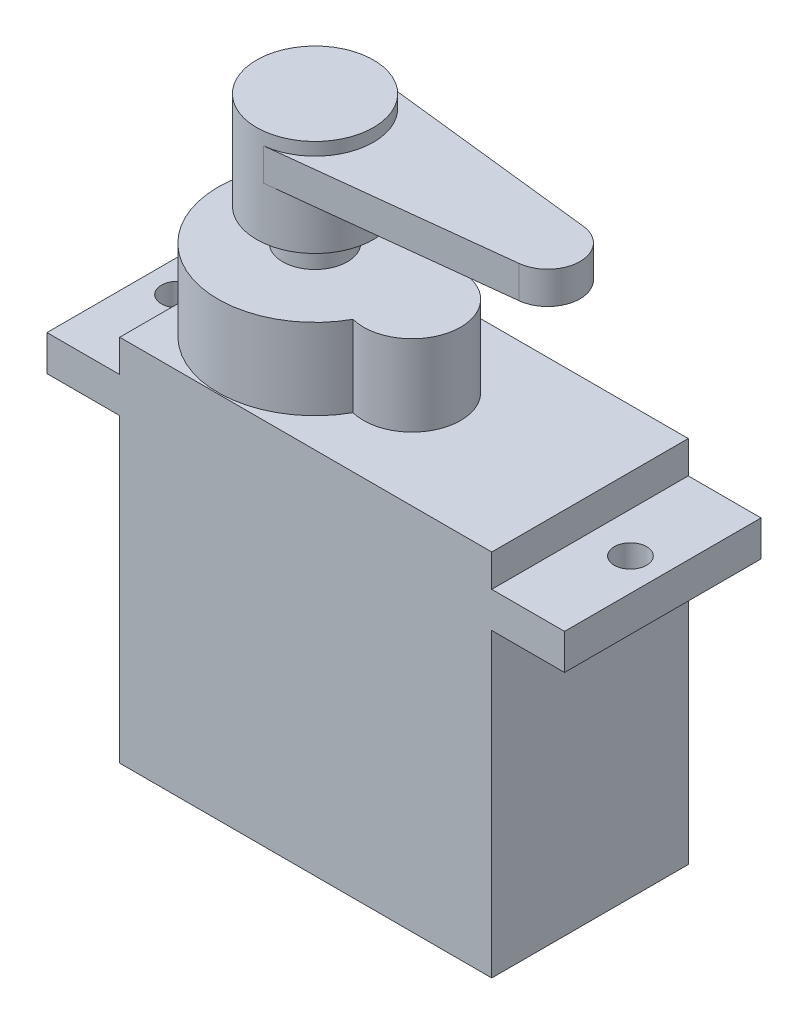
ISO-10303-21;
HEADER;
FILE_DESCRIPTION(('STEP AP214'),'2;1');
FILE_NAME('part.step','',(''),(''),'','','');
FILE_SCHEMA(('AUTOMOTIVE_DESIGN { 1 0 10303 214 1 1 1 1 }'));
ENDSEC;
DATA;
#1=APPLICATION_CONTEXT('core data for automotive mechanical design processes');
#2=APPLICATION_PROTOCOL_DEFINITION('international standard','automotive_design',2000,#1);
#3=PRODUCT_CONTEXT('',#1,'mechanical');
#4=PRODUCT('Part','Part','',(#3));
#5=PRODUCT_RELATED_PRODUCT_CATEGORY('part','',(#4));
#6=PRODUCT_DEFINITION_FORMATION('','',#4);
#7=PRODUCT_DEFINITION_CONTEXT('part definition',#1,'design');
#8=PRODUCT_DEFINITION('design','',#6,#7);
#9=PRODUCT_DEFINITION_SHAPE('','',#8);
#10=(LENGTH_UNIT() NAMED_UNIT(*) SI_UNIT(.MILLI.,.METRE.));
#11=(NAMED_UNIT(*) PLANE_ANGLE_UNIT() SI_UNIT($,.RADIAN.));
#12=(NAMED_UNIT(*) SI_UNIT($,.STERADIAN.) SOLID_ANGLE_UNIT());
#13=UNCERTAINTY_MEASURE_WITH_UNIT(LENGTH_MEASURE(1.E-05),#10,'distance_accuracy_value','');
#14=(GEOMETRIC_REPRESENTATION_CONTEXT(3) GLOBAL_UNCERTAINTY_ASSIGNED_CONTEXT((#13)) GLOBAL_UNIT_ASSIGNED_CONTEXT((#10,
#11,#12)) REPRESENTATION_CONTEXT('',''));
#15=CARTESIAN_POINT('',(0.,0.,0.));
#16=DIRECTION('',(0.,0.,1.));
#17=DIRECTION('',(1.,0.,0.));
#18=AXIS2_PLACEMENT_3D('',#15,#16,#17);
#19=CARTESIAN_POINT('',(-8.12640264026402,16.5354785478548,6.075));
#20=DIRECTION('',(0.,-1.,0.));
#21=DIRECTION('',(0.,0.,-1.));
#22=AXIS2_PLACEMENT_3D('',#19,#20,#21);
#23=CYLINDRICAL_SURFACE('',#22,3.615);
#24=CARTESIAN_POINT('',(-8.12640264026402,10.5354785478548,6.075));
#25=DIRECTION('',(0.,1.,0.));
#26=DIRECTION('',(0.,0.,1.));
#27=AXIS2_PLACEMENT_3D('',#24,#25,#26);
#28=CIRCLE('',#27,3.615);
#29=CARTESIAN_POINT('',(-8.12640264026402,10.5354785478548,9.69));
#30=VERTEX_POINT('',#29);
#31=EDGE_CURVE('E220',#30,#30,#28,.T.);
#32=ORIENTED_EDGE('',*,*,#31,.T.);
#33=EDGE_LOOP('',(#32));
#34=FACE_BOUND('',#33,.T.);
#35=CARTESIAN_POINT('',(-8.12640264026402,16.5354785478548,6.075));
#36=DIRECTION('',(0.,1.,0.));
#37=DIRECTION('',(0.,0.,1.));
#38=AXIS2_PLACEMENT_3D('',#35,#36,#37);
#39=CIRCLE('',#38,3.615);
#40=CARTESIAN_POINT('',(-8.12640264026402,16.5354785478548,9.69));
#41=VERTEX_POINT('',#40);
#42=EDGE_CURVE('E224',#41,#41,#39,.T.);
#43=ORIENTED_EDGE('',*,*,#42,.F.);
#44=EDGE_LOOP('',(#43));
#45=FACE_BOUND('',#44,.T.);
#46=CARTESIAN_POINT('',(-8.12640264026402,13.7454785478548,6.075));
#47=DIRECTION('',(0.,1.,0.));
#48=DIRECTION('',(0.,0.,1.));
#49=AXIS2_PLACEMENT_3D('',#46,#47,#48);
#50=CIRCLE('',#49,3.615);
#51=CARTESIAN_POINT('',(-7.72054758291261,13.7454785478548,9.66714513521131));
#52=VERTEX_POINT('',#51);
#53=CARTESIAN_POINT('',(-7.72054758291261,13.7454785478548,2.48285486478869));
#54=VERTEX_POINT('',#53);
#55=EDGE_CURVE('E193',#52,#54,#50,.T.);
#56=ORIENTED_EDGE('',*,*,#55,.F.);
#57=DIRECTION('',(0.,1.,0.));
#58=VECTOR('',#57,1.);
#59=CARTESIAN_POINT('',(-7.72054758291261,13.7454785478548,9.66714513521131));
#60=LINE('',#59,#58);
#61=CARTESIAN_POINT('',(-7.72054758291261,15.7454785478548,9.66714513521131));
#62=VERTEX_POINT('',#61);
#63=EDGE_CURVE('E199',#52,#62,#60,.T.);
#64=ORIENTED_EDGE('',*,*,#63,.T.);
#65=CARTESIAN_POINT('',(-8.12640264026402,15.7454785478548,6.075));
#66=DIRECTION('',(0.,1.,0.));
#67=DIRECTION('',(0.,0.,1.));
#68=AXIS2_PLACEMENT_3D('',#65,#66,#67);
#69=CIRCLE('',#68,3.615);
#70=CARTESIAN_POINT('',(-7.72054758291261,15.7454785478548,2.48285486478869));
#71=VERTEX_POINT('',#70);
#72=EDGE_CURVE('E203',#62,#71,#69,.T.);
#73=ORIENTED_EDGE('',*,*,#72,.T.);
#74=DIRECTION('',(0.,1.,0.));
#75=VECTOR('',#74,1.);
#76=CARTESIAN_POINT('',(-7.72054758291261,13.7454785478548,2.48285486478869));
#77=LINE('',#76,#75);
#78=EDGE_CURVE('E221',#54,#71,#77,.T.);
#79=ORIENTED_EDGE('',*,*,#78,.F.);
#80=EDGE_LOOP('',(#56,#64,#73,#79));
#81=FACE_BOUND('',#80,.T.);
#82=ADVANCED_FACE('F51',(#34,#45,#81),#23,.T.);
#83=CARTESIAN_POINT('',(8.87359735973598,-0.664521452145198,12.15));
#84=DIRECTION('',(-1.,0.,0.));
#85=DIRECTION('',(0.,-1.,0.));
#86=AXIS2_PLACEMENT_3D('',#83,#84,#85);
#87=PLANE('',#86);
#88=DIRECTION('',(0.,1.,0.));
#89=VECTOR('',#88,1.);
#90=CARTESIAN_POINT('',(8.87359735973598,-0.664521452145198,0.));
#91=LINE('',#90,#89);
#92=CARTESIAN_POINT('',(8.87359735973598,-19.2745214521452,0.));
#93=VERTEX_POINT('',#92);
#94=CARTESIAN_POINT('',(8.87359735973598,-0.664521452145198,0.));
#95=VERTEX_POINT('',#94);
#96=EDGE_CURVE('E259',#93,#95,#91,.T.);
#97=ORIENTED_EDGE('',*,*,#96,.T.);
#98=DIRECTION('',(0.,0.,-1.));
#99=VECTOR('',#98,1.);
#100=CARTESIAN_POINT('',(8.87359735973598,-0.664521452145198,12.15));
#101=LINE('',#100,#99);
#102=CARTESIAN_POINT('',(8.87359735973598,-0.664521452145198,12.15));
#103=VERTEX_POINT('',#102);
#104=EDGE_CURVE('E344',#103,#95,#101,.T.);
#105=ORIENTED_EDGE('',*,*,#104,.F.);
#106=DIRECTION('',(0.,1.,0.));
#107=VECTOR('',#106,1.);
#108=CARTESIAN_POINT('',(8.87359735973598,-0.664521452145198,12.15));
#109=LINE('',#108,#107);
#110=CARTESIAN_POINT('',(8.87359735973598,-19.2745214521452,12.15));
#111=VERTEX_POINT('',#110);
#112=EDGE_CURVE('E260',#111,#103,#109,.T.);
#113=ORIENTED_EDGE('',*,*,#112,.F.);
#114=DIRECTION('',(0.,0.,-1.));
#115=VECTOR('',#114,1.);
#116=CARTESIAN_POINT('',(8.87359735973598,-19.2745214521452,12.15));
#117=LINE('',#116,#115);
#118=EDGE_CURVE('E286',#111,#93,#117,.T.);
#119=ORIENTED_EDGE('',*,*,#118,.T.);
#120=EDGE_LOOP('',(#97,#105,#113,#119));
#121=FACE_BOUND('',#120,.T.);
#122=ADVANCED_FACE('F53',(#121),#87,.F.);
#123=CARTESIAN_POINT('',(13.373597359736,-0.664521452145197,12.15));
#124=DIRECTION('',(0.,1.,0.));
#125=DIRECTION('',(-1.,0.,0.));
#126=AXIS2_PLACEMENT_3D('',#123,#124,#125);
#127=PLANE('',#126);
#128=CARTESIAN_POINT('',(11.373597359736,-0.664521452145198,6.075));
#129=DIRECTION('',(0.,1.,0.));
#130=DIRECTION('',(-1.,0.,0.));
#131=AXIS2_PLACEMENT_3D('',#128,#129,#130);
#132=CIRCLE('',#131,1.);
#133=CARTESIAN_POINT('',(10.373597359736,-0.664521452145198,6.075));
#134=VERTEX_POINT('',#133);
#135=EDGE_CURVE('E256',#134,#134,#132,.T.);
#136=ORIENTED_EDGE('',*,*,#135,.T.);
#137=EDGE_LOOP('',(#136));
#138=FACE_BOUND('',#137,.T.);
#139=DIRECTION('',(1.,0.,0.));
#140=VECTOR('',#139,1.);
#141=CARTESIAN_POINT('',(13.373597359736,-0.664521452145197,0.));
#142=LINE('',#141,#140);
#143=CARTESIAN_POINT('',(13.373597359736,-0.664521452145197,0.));
#144=VERTEX_POINT('',#143);
#145=EDGE_CURVE('E289',#95,#144,#142,.T.);
#146=ORIENTED_EDGE('',*,*,#145,.T.);
#147=DIRECTION('',(0.,0.,-1.));
#148=VECTOR('',#147,1.);
#149=CARTESIAN_POINT('',(13.373597359736,-0.664521452145197,12.15));
#150=LINE('',#149,#148);
#151=CARTESIAN_POINT('',(13.373597359736,-0.664521452145197,12.15));
#152=VERTEX_POINT('',#151);
#153=EDGE_CURVE('E342',#152,#144,#150,.T.);
#154=ORIENTED_EDGE('',*,*,#153,.F.);
#155=DIRECTION('',(1.,0.,0.));
#156=VECTOR('',#155,1.);
#157=CARTESIAN_POINT('',(13.373597359736,-0.664521452145197,12.15));
#158=LINE('',#157,#156);
#159=EDGE_CURVE('E263',#103,#152,#158,.T.);
#160=ORIENTED_EDGE('',*,*,#159,.F.);
#161=ORIENTED_EDGE('',*,*,#104,.T.);
#162=EDGE_LOOP('',(#146,#154,#160,#161));
#163=FACE_BOUND('',#162,.T.);
#164=ADVANCED_FACE('F379',(#138,#163),#127,.F.);
#165=CARTESIAN_POINT('',(13.373597359736,1.5354785478548,12.15));
#166=DIRECTION('',(-1.,0.,0.));
#167=DIRECTION('',(0.,0.,1.));
#168=AXIS2_PLACEMENT_3D('',#165,#166,#167);
#169=PLANE('',#168);
#170=DIRECTION('',(0.,1.,0.));
#171=VECTOR('',#170,1.);
#172=CARTESIAN_POINT('',(13.373597359736,1.5354785478548,0.));
#173=LINE('',#172,#171);
#174=CARTESIAN_POINT('',(13.373597359736,1.5354785478548,0.));
#175=VERTEX_POINT('',#174);
#176=EDGE_CURVE('E291',#144,#175,#173,.T.);
#177=ORIENTED_EDGE('',*,*,#176,.T.);
#178=DIRECTION('',(0.,0.,-1.));
#179=VECTOR('',#178,1.);
#180=CARTESIAN_POINT('',(13.373597359736,1.5354785478548,12.15));
#181=LINE('',#180,#179);
#182=CARTESIAN_POINT('',(13.373597359736,1.5354785478548,12.15));
#183=VERTEX_POINT('',#182);
#184=EDGE_CURVE('E339',#183,#175,#181,.T.);
#185=ORIENTED_EDGE('',*,*,#184,.F.);
#186=DIRECTION('',(0.,1.,0.));
#187=VECTOR('',#186,1.);
#188=CARTESIAN_POINT('',(13.373597359736,1.5354785478548,12.15));
#189=LINE('',#188,#187);
#190=EDGE_CURVE('E266',#152,#183,#189,.T.);
#191=ORIENTED_EDGE('',*,*,#190,.F.);
#192=ORIENTED_EDGE('',*,*,#153,.T.);
#193=EDGE_LOOP('',(#177,#185,#191,#192));
#194=FACE_BOUND('',#193,.T.);
#195=ADVANCED_FACE('F603',(#194),#169,.F.);
#196=CARTESIAN_POINT('',(8.87359735973597,1.5354785478548,12.15));
#197=DIRECTION('',(0.,-1.,0.));
#198=DIRECTION('',(0.,0.,-1.));
#199=AXIS2_PLACEMENT_3D('',#196,#197,#198);
#200=PLANE('',#199);
#201=CARTESIAN_POINT('',(11.373597359736,1.53547854785478,6.075));
#202=DIRECTION('',(0.,1.,0.));
#203=DIRECTION('',(0.,0.,1.));
#204=AXIS2_PLACEMENT_3D('',#201,#202,#203);
#205=CIRCLE('',#204,1.);
#206=CARTESIAN_POINT('',(11.373597359736,1.53547854785478,7.075));
#207=VERTEX_POINT('',#206);
#208=EDGE_CURVE('E250',#207,#207,#205,.T.);
#209=ORIENTED_EDGE('',*,*,#208,.F.);
#210=EDGE_LOOP('',(#209));
#211=FACE_BOUND('',#210,.T.);
#212=DIRECTION('',(-1.,0.,0.));
#213=VECTOR('',#212,1.);
#214=CARTESIAN_POINT('',(8.87359735973597,1.5354785478548,0.));
#215=LINE('',#214,#213);
#216=CARTESIAN_POINT('',(8.87359735973597,1.5354785478548,0.));
#217=VERTEX_POINT('',#216);
#218=EDGE_CURVE('E293',#175,#217,#215,.T.);
#219=ORIENTED_EDGE('',*,*,#218,.T.);
#220=DIRECTION('',(0.,0.,-1.));
#221=VECTOR('',#220,1.);
#222=CARTESIAN_POINT('',(8.87359735973597,1.5354785478548,12.15));
#223=LINE('',#222,#221);
#224=CARTESIAN_POINT('',(8.87359735973597,1.5354785478548,12.15));
#225=VERTEX_POINT('',#224);
#226=EDGE_CURVE('E336',#225,#217,#223,.T.);
#227=ORIENTED_EDGE('',*,*,#226,.F.);
#228=DIRECTION('',(-1.,0.,0.));
#229=VECTOR('',#228,1.);
#230=CARTESIAN_POINT('',(8.87359735973597,1.5354785478548,12.15));
#231=LINE('',#230,#229);
#232=EDGE_CURVE('E268',#183,#225,#231,.T.);
#233=ORIENTED_EDGE('',*,*,#232,.F.);
#234=ORIENTED_EDGE('',*,*,#184,.T.);
#235=EDGE_LOOP('',(#219,#227,#233,#234));
#236=FACE_BOUND('',#235,.T.);
#237=ADVANCED_FACE('F594',(#211,#236),#200,.F.);
#238=CARTESIAN_POINT('',(8.87359735973598,3.5354785478548,12.15));
#239=DIRECTION('',(-1.,0.,0.));
#240=DIRECTION('',(0.,-1.,0.));
#241=AXIS2_PLACEMENT_3D('',#238,#239,#240);
#242=PLANE('',#241);
#243=DIRECTION('',(0.,1.,0.));
#244=VECTOR('',#243,1.);
#245=CARTESIAN_POINT('',(8.87359735973598,3.5354785478548,0.));
#246=LINE('',#245,#244);
#247=CARTESIAN_POINT('',(8.87359735973598,3.5354785478548,0.));
#248=VERTEX_POINT('',#247);
#249=EDGE_CURVE('E295',#217,#248,#246,.T.);
#250=ORIENTED_EDGE('',*,*,#249,.T.);
#251=DIRECTION('',(0.,0.,-1.));
#252=VECTOR('',#251,1.);
#253=CARTESIAN_POINT('',(8.87359735973598,3.5354785478548,12.15));
#254=LINE('',#253,#252);
#255=CARTESIAN_POINT('',(8.87359735973598,3.5354785478548,12.15));
#256=VERTEX_POINT('',#255);
#257=EDGE_CURVE('E333',#256,#248,#254,.T.);
#258=ORIENTED_EDGE('',*,*,#257,.F.);
#259=DIRECTION('',(0.,1.,0.));
#260=VECTOR('',#259,1.);
#261=CARTESIAN_POINT('',(8.87359735973598,3.5354785478548,12.15));
#262=LINE('',#261,#260);
#263=EDGE_CURVE('E270',#225,#256,#262,.T.);
#264=ORIENTED_EDGE('',*,*,#263,.F.);
#265=ORIENTED_EDGE('',*,*,#226,.T.);
#266=EDGE_LOOP('',(#250,#258,#264,#265));
#267=FACE_BOUND('',#266,.T.);
#268=ADVANCED_FACE('F585',(#267),#242,.F.);
#269=CARTESIAN_POINT('',(-14.126402640264,3.5354785478548,12.15));
#270=DIRECTION('',(0.,-1.,0.));
#271=DIRECTION('',(0.,0.,-1.));
#272=AXIS2_PLACEMENT_3D('',#269,#270,#271);
#273=PLANE('',#272);
#274=CARTESIAN_POINT('',(-8.12640264026402,3.5354785478548,6.075));
#275=DIRECTION('',(0.,1.,0.));
#276=DIRECTION('',(0.,0.,1.));
#277=AXIS2_PLACEMENT_3D('',#274,#275,#276);
#278=CIRCLE('',#277,6.);
#279=CARTESIAN_POINT('',(-2.87640264026402,3.5354785478548,3.17026249034444));
#280=VERTEX_POINT('',#279);
#281=CARTESIAN_POINT('',(-14.126402640264,3.5354785478548,6.075));
#282=VERTEX_POINT('',#281);
#283=EDGE_CURVE('E236',#280,#282,#278,.T.);
#284=ORIENTED_EDGE('',*,*,#283,.F.);
#285=CARTESIAN_POINT('',(-2.12640264026402,3.5354785478548,6.075));
#286=DIRECTION('',(0.,1.,0.));
#287=DIRECTION('',(0.,0.,1.));
#288=AXIS2_PLACEMENT_3D('',#285,#286,#287);
#289=CIRCLE('',#288,3.);
#290=CARTESIAN_POINT('',(-2.87640264026402,3.5354785478548,8.97973750965556));
#291=VERTEX_POINT('',#290);
#292=EDGE_CURVE('E76',#291,#280,#289,.T.);
#293=ORIENTED_EDGE('',*,*,#292,.F.);
#294=EDGE_CURVE('E60',#282,#291,#278,.T.);
#295=ORIENTED_EDGE('',*,*,#294,.F.);
#296=DIRECTION('',(0.,0.,-1.));
#297=VECTOR('',#296,1.);
#298=CARTESIAN_POINT('',(-14.126402640264,3.5354785478548,12.15));
#299=LINE('',#298,#297);
#300=CARTESIAN_POINT('',(-14.126402640264,3.5354785478548,12.15));
#301=VERTEX_POINT('',#300);
#302=EDGE_CURVE('E330',#301,#282,#299,.T.);
#303=ORIENTED_EDGE('',*,*,#302,.F.);
#304=DIRECTION('',(-1.,0.,0.));
#305=VECTOR('',#304,1.);
#306=CARTESIAN_POINT('',(-14.126402640264,3.5354785478548,12.15));
#307=LINE('',#306,#305);
#308=EDGE_CURVE('E272',#256,#301,#307,.T.);
#309=ORIENTED_EDGE('',*,*,#308,.F.);
#310=ORIENTED_EDGE('',*,*,#257,.T.);
#311=DIRECTION('',(-1.,0.,0.));
#312=VECTOR('',#311,1.);
#313=CARTESIAN_POINT('',(-14.126402640264,3.5354785478548,0.));
#314=LINE('',#313,#312);
#315=CARTESIAN_POINT('',(-14.126402640264,3.5354785478548,0.));
#316=VERTEX_POINT('',#315);
#317=EDGE_CURVE('E297',#248,#316,#314,.T.);
#318=ORIENTED_EDGE('',*,*,#317,.T.);
#319=EDGE_CURVE('E329',#282,#316,#299,.T.);
#320=ORIENTED_EDGE('',*,*,#319,.F.);
#321=EDGE_LOOP('',(#284,#293,#295,#303,#309,#310,#318,#320));
#322=FACE_BOUND('',#321,.T.);
#323=ADVANCED_FACE('F576',(#322),#273,.F.);
#324=CARTESIAN_POINT('',(-14.126402640264,1.53547854785478,12.15));
#325=DIRECTION('',(1.,0.,0.));
#326=DIRECTION('',(0.,1.,0.));
#327=AXIS2_PLACEMENT_3D('',#324,#325,#326);
#328=PLANE('',#327);
#329=DIRECTION('',(0.,-1.,0.));
#330=VECTOR('',#329,1.);
#331=CARTESIAN_POINT('',(-14.126402640264,1.53547854785478,0.));
#332=LINE('',#331,#330);
#333=CARTESIAN_POINT('',(-14.126402640264,1.53547854785478,0.));
#334=VERTEX_POINT('',#333);
#335=EDGE_CURVE('E301',#316,#334,#332,.T.);
#336=ORIENTED_EDGE('',*,*,#335,.T.);
#337=DIRECTION('',(0.,0.,-1.));
#338=VECTOR('',#337,1.);
#339=CARTESIAN_POINT('',(-14.126402640264,1.53547854785478,12.15));
#340=LINE('',#339,#338);
#341=CARTESIAN_POINT('',(-14.126402640264,1.53547854785478,12.15));
#342=VERTEX_POINT('',#341);
#343=EDGE_CURVE('E326',#342,#334,#340,.T.);
#344=ORIENTED_EDGE('',*,*,#343,.F.);
#345=DIRECTION('',(0.,-1.,0.));
#346=VECTOR('',#345,1.);
#347=CARTESIAN_POINT('',(-14.126402640264,1.53547854785478,12.15));
#348=LINE('',#347,#346);
#349=EDGE_CURVE('E274',#301,#342,#348,.T.);
#350=ORIENTED_EDGE('',*,*,#349,.F.);
#351=ORIENTED_EDGE('',*,*,#302,.T.);
#352=ORIENTED_EDGE('',*,*,#319,.T.);
#353=EDGE_LOOP('',(#336,#344,#350,#351,#352));
#354=FACE_BOUND('',#353,.T.);
#355=ADVANCED_FACE('F567',(#354),#328,.F.);
#356=CARTESIAN_POINT('',(-18.626402640264,1.53547854785478,12.15));
#357=DIRECTION('',(0.,-1.,0.));
#358=DIRECTION('',(0.,0.,-1.));
#359=AXIS2_PLACEMENT_3D('',#356,#357,#358);
#360=PLANE('',#359);
#361=CARTESIAN_POINT('',(-16.626402640264,1.53547854785478,6.075));
#362=DIRECTION('',(0.,1.,0.));
#363=DIRECTION('',(0.,0.,1.));
#364=AXIS2_PLACEMENT_3D('',#361,#362,#363);
#365=CIRCLE('',#364,1.);
#366=CARTESIAN_POINT('',(-16.626402640264,1.53547854785478,7.075));
#367=VERTEX_POINT('',#366);
#368=EDGE_CURVE('E251',#367,#367,#365,.T.);
#369=ORIENTED_EDGE('',*,*,#368,.F.);
#370=EDGE_LOOP('',(#369));
#371=FACE_BOUND('',#370,.T.);
#372=DIRECTION('',(-1.,0.,0.));
#373=VECTOR('',#372,1.);
#374=CARTESIAN_POINT('',(-18.626402640264,1.53547854785478,0.));
#375=LINE('',#374,#373);
#376=CARTESIAN_POINT('',(-18.626402640264,1.53547854785478,0.));
#377=VERTEX_POINT('',#376);
#378=EDGE_CURVE('E303',#334,#377,#375,.T.);
#379=ORIENTED_EDGE('',*,*,#378,.T.);
#380=DIRECTION('',(0.,0.,-1.));
#381=VECTOR('',#380,1.);
#382=CARTESIAN_POINT('',(-18.626402640264,1.53547854785478,12.15));
#383=LINE('',#382,#381);
#384=CARTESIAN_POINT('',(-18.626402640264,1.53547854785478,12.15));
#385=VERTEX_POINT('',#384);
#386=EDGE_CURVE('E323',#385,#377,#383,.T.);
#387=ORIENTED_EDGE('',*,*,#386,.F.);
#388=DIRECTION('',(-1.,0.,0.));
#389=VECTOR('',#388,1.);
#390=CARTESIAN_POINT('',(-18.626402640264,1.53547854785478,12.15));
#391=LINE('',#390,#389);
#392=EDGE_CURVE('E276',#342,#385,#391,.T.);
#393=ORIENTED_EDGE('',*,*,#392,.F.);
#394=ORIENTED_EDGE('',*,*,#343,.T.);
#395=EDGE_LOOP('',(#379,#387,#393,#394));
#396=FACE_BOUND('',#395,.T.);
#397=ADVANCED_FACE('F558',(#371,#396),#360,.F.);
#398=CARTESIAN_POINT('',(-18.626402640264,-0.664521452145221,12.15));
#399=DIRECTION('',(1.,0.,0.));
#400=DIRECTION('',(0.,0.,-1.));
#401=AXIS2_PLACEMENT_3D('',#398,#399,#400);
#402=PLANE('',#401);
#403=DIRECTION('',(0.,-1.,0.));
#404=VECTOR('',#403,1.);
#405=CARTESIAN_POINT('',(-18.626402640264,-0.664521452145221,0.));
#406=LINE('',#405,#404);
#407=CARTESIAN_POINT('',(-18.626402640264,-0.664521452145221,0.));
#408=VERTEX_POINT('',#407);
#409=EDGE_CURVE('E305',#377,#408,#406,.T.);
#410=ORIENTED_EDGE('',*,*,#409,.T.);
#411=DIRECTION('',(0.,0.,-1.));
#412=VECTOR('',#411,1.);
#413=CARTESIAN_POINT('',(-18.626402640264,-0.664521452145221,12.15));
#414=LINE('',#413,#412);
#415=CARTESIAN_POINT('',(-18.626402640264,-0.664521452145221,12.15));
#416=VERTEX_POINT('',#415);
#417=EDGE_CURVE('E320',#416,#408,#414,.T.);
#418=ORIENTED_EDGE('',*,*,#417,.F.);
#419=DIRECTION('',(0.,-1.,0.));
#420=VECTOR('',#419,1.);
#421=CARTESIAN_POINT('',(-18.626402640264,-0.664521452145221,12.15));
#422=LINE('',#421,#420);
#423=EDGE_CURVE('E278',#385,#416,#422,.T.);
#424=ORIENTED_EDGE('',*,*,#423,.F.);
#425=ORIENTED_EDGE('',*,*,#386,.T.);
#426=EDGE_LOOP('',(#410,#418,#424,#425));
#427=FACE_BOUND('',#426,.T.);
#428=ADVANCED_FACE('F549',(#427),#402,.F.);
#429=CARTESIAN_POINT('',(-14.126402640264,-0.664521452145201,12.15));
#430=DIRECTION('',(0.,1.,0.));
#431=DIRECTION('',(-1.,0.,0.));
#432=AXIS2_PLACEMENT_3D('',#429,#430,#431);
#433=PLANE('',#432);
#434=CARTESIAN_POINT('',(-16.626402640264,-0.664521452145211,6.075));
#435=DIRECTION('',(0.,1.,0.));
#436=DIRECTION('',(-1.,0.,0.));
#437=AXIS2_PLACEMENT_3D('',#434,#435,#436);
#438=CIRCLE('',#437,1.);
#439=CARTESIAN_POINT('',(-17.626402640264,-0.664521452145216,6.075));
#440=VERTEX_POINT('',#439);
#441=EDGE_CURVE('E55',#440,#440,#438,.T.);
#442=ORIENTED_EDGE('',*,*,#441,.T.);
#443=EDGE_LOOP('',(#442));
#444=FACE_BOUND('',#443,.T.);
#445=DIRECTION('',(1.,0.,0.));
#446=VECTOR('',#445,1.);
#447=CARTESIAN_POINT('',(-14.126402640264,-0.664521452145201,0.));
#448=LINE('',#447,#446);
#449=CARTESIAN_POINT('',(-14.126402640264,-0.664521452145201,0.));
#450=VERTEX_POINT('',#449);
#451=EDGE_CURVE('E307',#408,#450,#448,.T.);
#452=ORIENTED_EDGE('',*,*,#451,.T.);
#453=DIRECTION('',(0.,0.,-1.));
#454=VECTOR('',#453,1.);
#455=CARTESIAN_POINT('',(-14.126402640264,-0.664521452145201,12.15));
#456=LINE('',#455,#454);
#457=CARTESIAN_POINT('',(-14.126402640264,-0.664521452145201,12.15));
#458=VERTEX_POINT('',#457);
#459=EDGE_CURVE('E317',#458,#450,#456,.T.);
#460=ORIENTED_EDGE('',*,*,#459,.F.);
#461=DIRECTION('',(1.,0.,0.));
#462=VECTOR('',#461,1.);
#463=CARTESIAN_POINT('',(-14.126402640264,-0.664521452145201,12.15));
#464=LINE('',#463,#462);
#465=EDGE_CURVE('E280',#416,#458,#464,.T.);
#466=ORIENTED_EDGE('',*,*,#465,.F.);
#467=ORIENTED_EDGE('',*,*,#417,.T.);
#468=EDGE_LOOP('',(#452,#460,#466,#467));
#469=FACE_BOUND('',#468,.T.);
#470=ADVANCED_FACE('F540',(#444,#469),#433,.F.);
#471=CARTESIAN_POINT('',(-14.126402640264,-19.2745214521452,12.15));
#472=DIRECTION('',(1.,0.,0.));
#473=DIRECTION('',(0.,0.,-1.));
#474=AXIS2_PLACEMENT_3D('',#471,#472,#473);
#475=PLANE('',#474);
#476=DIRECTION('',(0.,-1.,0.));
#477=VECTOR('',#476,1.);
#478=CARTESIAN_POINT('',(-14.126402640264,-19.2745214521452,0.));
#479=LINE('',#478,#477);
#480=CARTESIAN_POINT('',(-14.126402640264,-19.2745214521452,0.));
#481=VERTEX_POINT('',#480);
#482=EDGE_CURVE('E309',#450,#481,#479,.T.);
#483=ORIENTED_EDGE('',*,*,#482,.T.);
#484=DIRECTION('',(0.,0.,-1.));
#485=VECTOR('',#484,1.);
#486=CARTESIAN_POINT('',(-14.126402640264,-19.2745214521452,12.15));
#487=LINE('',#486,#485);
#488=CARTESIAN_POINT('',(-14.126402640264,-19.2745214521452,12.15));
#489=VERTEX_POINT('',#488);
#490=EDGE_CURVE('E314',#489,#481,#487,.T.);
#491=ORIENTED_EDGE('',*,*,#490,.F.);
#492=DIRECTION('',(0.,-1.,0.));
#493=VECTOR('',#492,1.);
#494=CARTESIAN_POINT('',(-14.126402640264,-19.2745214521452,12.15));
#495=LINE('',#494,#493);
#496=EDGE_CURVE('E282',#458,#489,#495,.T.);
#497=ORIENTED_EDGE('',*,*,#496,.F.);
#498=ORIENTED_EDGE('',*,*,#459,.T.);
#499=EDGE_LOOP('',(#483,#491,#497,#498));
#500=FACE_BOUND('',#499,.T.);
#501=ADVANCED_FACE('F531',(#500),#475,.F.);
#502=CARTESIAN_POINT('',(8.87359735973598,-19.2745214521452,12.15));
#503=DIRECTION('',(0.,1.,0.));
#504=DIRECTION('',(0.,0.,1.));
#505=AXIS2_PLACEMENT_3D('',#502,#503,#504);
#506=PLANE('',#505);
#507=DIRECTION('',(1.,0.,0.));
#508=VECTOR('',#507,1.);
#509=CARTESIAN_POINT('',(8.87359735973598,-19.2745214521452,0.));
#510=LINE('',#509,#508);
#511=EDGE_CURVE('E264',#481,#93,#510,.T.);
#512=ORIENTED_EDGE('',*,*,#511,.T.);
#513=ORIENTED_EDGE('',*,*,#118,.F.);
#514=DIRECTION('',(1.,0.,0.));
#515=VECTOR('',#514,1.);
#516=CARTESIAN_POINT('',(8.87359735973598,-19.2745214521452,12.15));
#517=LINE('',#516,#515);
#518=EDGE_CURVE('E284',#489,#111,#517,.T.);
#519=ORIENTED_EDGE('',*,*,#518,.F.);
#520=ORIENTED_EDGE('',*,*,#490,.T.);
#521=EDGE_LOOP('',(#512,#513,#519,#520));
#522=FACE_BOUND('',#521,.T.);
#523=ADVANCED_FACE('F522',(#522),#506,.F.);
#524=CARTESIAN_POINT('',(0.,0.,12.15));
#525=DIRECTION('',(0.,0.,-1.));
#526=DIRECTION('',(-1.,0.,0.));
#527=AXIS2_PLACEMENT_3D('',#524,#525,#526);
#528=PLANE('',#527);
#529=ORIENTED_EDGE('',*,*,#112,.T.);
#530=ORIENTED_EDGE('',*,*,#159,.T.);
#531=ORIENTED_EDGE('',*,*,#190,.T.);
#532=ORIENTED_EDGE('',*,*,#232,.T.);
#533=ORIENTED_EDGE('',*,*,#263,.T.);
#534=ORIENTED_EDGE('',*,*,#308,.T.);
#535=ORIENTED_EDGE('',*,*,#349,.T.);
#536=ORIENTED_EDGE('',*,*,#392,.T.);
#537=ORIENTED_EDGE('',*,*,#423,.T.);
#538=ORIENTED_EDGE('',*,*,#465,.T.);
#539=ORIENTED_EDGE('',*,*,#496,.T.);
#540=ORIENTED_EDGE('',*,*,#518,.T.);
#541=EDGE_LOOP('',(#529,#530,#531,#532,#533,#534,#535,#536,#537,#538,#539,#540));
#542=FACE_BOUND('',#541,.T.);
#543=ADVANCED_FACE('F512',(#542),#528,.F.);
#544=CARTESIAN_POINT('',(0.,0.,0.));
#545=DIRECTION('',(0.,0.,-1.));
#546=DIRECTION('',(-1.,0.,0.));
#547=AXIS2_PLACEMENT_3D('',#544,#545,#546);
#548=PLANE('',#547);
#549=ORIENTED_EDGE('',*,*,#96,.F.);
#550=ORIENTED_EDGE('',*,*,#511,.F.);
#551=ORIENTED_EDGE('',*,*,#482,.F.);
#552=ORIENTED_EDGE('',*,*,#451,.F.);
#553=ORIENTED_EDGE('',*,*,#409,.F.);
#554=ORIENTED_EDGE('',*,*,#378,.F.);
#555=ORIENTED_EDGE('',*,*,#335,.F.);
#556=ORIENTED_EDGE('',*,*,#317,.F.);
#557=ORIENTED_EDGE('',*,*,#249,.F.);
#558=ORIENTED_EDGE('',*,*,#218,.F.);
#559=ORIENTED_EDGE('',*,*,#176,.F.);
#560=ORIENTED_EDGE('',*,*,#145,.F.);
#561=EDGE_LOOP('',(#549,#550,#551,#552,#553,#554,#555,#556,#557,#558,#559,#560));
#562=FACE_BOUND('',#561,.T.);
#563=ADVANCED_FACE('F503',(#562),#548,.T.);
#564=CARTESIAN_POINT('',(-16.626402640264,-10.6145214521452,6.075));
#565=DIRECTION('',(0.,1.,0.));
#566=DIRECTION('',(0.,0.,1.));
#567=AXIS2_PLACEMENT_3D('',#564,#565,#566);
#568=CYLINDRICAL_SURFACE('',#567,1.);
#569=ORIENTED_EDGE('',*,*,#368,.T.);
#570=EDGE_LOOP('',(#569));
#571=FACE_BOUND('',#570,.T.);
#572=ORIENTED_EDGE('',*,*,#441,.F.);
#573=EDGE_LOOP('',(#572));
#574=FACE_BOUND('',#573,.T.);
#575=ADVANCED_FACE('F494',(#571,#574),#568,.F.);
#576=CARTESIAN_POINT('',(11.373597359736,-10.6145214521452,6.075));
#577=DIRECTION('',(0.,1.,0.));
#578=DIRECTION('',(0.,0.,1.));
#579=AXIS2_PLACEMENT_3D('',#576,#577,#578);
#580=CYLINDRICAL_SURFACE('',#579,1.);
#581=ORIENTED_EDGE('',*,*,#208,.T.);
#582=EDGE_LOOP('',(#581));
#583=FACE_BOUND('',#582,.T.);
#584=ORIENTED_EDGE('',*,*,#135,.F.);
#585=EDGE_LOOP('',(#584));
#586=FACE_BOUND('',#585,.T.);
#587=ADVANCED_FACE('F367',(#583,#586),#580,.F.);
#588=CARTESIAN_POINT('',(-8.12640264026402,8.5354785478548,6.075));
#589=DIRECTION('',(0.,-1.,0.));
#590=DIRECTION('',(0.,0.,-1.));
#591=AXIS2_PLACEMENT_3D('',#588,#589,#590);
#592=CYLINDRICAL_SURFACE('',#591,6.);
#593=DIRECTION('',(0.,-1.,0.));
#594=VECTOR('',#593,1.);
#595=CARTESIAN_POINT('',(-2.87640264026402,6.0354785478548,8.97973750965556));
#596=LINE('',#595,#594);
#597=CARTESIAN_POINT('',(-2.87640264026402,8.5354785478548,8.97973750965556));
#598=VERTEX_POINT('',#597);
#599=EDGE_CURVE('E247',#598,#291,#596,.T.);
#600=ORIENTED_EDGE('',*,*,#599,.F.);
#601=CARTESIAN_POINT('',(-8.12640264026402,8.5354785478548,6.075));
#602=DIRECTION('',(0.,1.,0.));
#603=DIRECTION('',(0.,0.,1.));
#604=AXIS2_PLACEMENT_3D('',#601,#602,#603);
#605=CIRCLE('',#604,6.);
#606=CARTESIAN_POINT('',(-2.87640264026402,8.5354785478548,3.17026249034444));
#607=VERTEX_POINT('',#606);
#608=EDGE_CURVE('E232',#607,#598,#605,.T.);
#609=ORIENTED_EDGE('',*,*,#608,.F.);
#610=DIRECTION('',(0.,-1.,0.));
#611=VECTOR('',#610,1.);
#612=CARTESIAN_POINT('',(-2.87640264026402,6.0354785478548,3.17026249034444));
#613=LINE('',#612,#611);
#614=EDGE_CURVE('E235',#280,#607,#613,.F.);
#615=ORIENTED_EDGE('',*,*,#614,.F.);
#616=ORIENTED_EDGE('',*,*,#283,.T.);
#617=ORIENTED_EDGE('',*,*,#294,.T.);
#618=EDGE_LOOP('',(#600,#609,#615,#616,#617));
#619=FACE_BOUND('',#618,.T.);
#620=ADVANCED_FACE('F349',(#619),#592,.T.);
#621=CARTESIAN_POINT('',(0.,8.5354785478548,0.));
#622=DIRECTION('',(0.,1.,0.));
#623=DIRECTION('',(0.,0.,1.));
#624=AXIS2_PLACEMENT_3D('',#621,#622,#623);
#625=PLANE('',#624);
#626=CARTESIAN_POINT('',(-8.12640264026402,8.5354785478548,6.075));
#627=DIRECTION('',(0.,1.,0.));
#628=DIRECTION('',(0.,0.,1.));
#629=AXIS2_PLACEMENT_3D('',#626,#627,#628);
#630=CIRCLE('',#629,2.);
#631=CARTESIAN_POINT('',(-8.12640264026402,8.5354785478548,8.075));
#632=VERTEX_POINT('',#631);
#633=EDGE_CURVE('E12',#632,#632,#630,.T.);
#634=ORIENTED_EDGE('',*,*,#633,.F.);
#635=EDGE_LOOP('',(#634));
#636=FACE_BOUND('',#635,.T.);
#637=ORIENTED_EDGE('',*,*,#608,.T.);
#638=CARTESIAN_POINT('',(-2.12640264026402,8.5354785478548,6.075));
#639=DIRECTION('',(0.,1.,0.));
#640=DIRECTION('',(0.,0.,1.));
#641=AXIS2_PLACEMENT_3D('',#638,#639,#640);
#642=CIRCLE('',#641,3.);
#643=EDGE_CURVE('E240',#598,#607,#642,.T.);
#644=ORIENTED_EDGE('',*,*,#643,.T.);
#645=EDGE_LOOP('',(#637,#644));
#646=FACE_BOUND('',#645,.T.);
#647=ADVANCED_FACE('F358',(#636,#646),#625,.T.);
#648=CARTESIAN_POINT('',(-2.12640264026402,8.5354785478548,6.075));
#649=DIRECTION('',(0.,-1.,0.));
#650=DIRECTION('',(0.,0.,-1.));
#651=AXIS2_PLACEMENT_3D('',#648,#649,#650);
#652=CYLINDRICAL_SURFACE('',#651,3.);
#653=ORIENTED_EDGE('',*,*,#643,.F.);
#654=ORIENTED_EDGE('',*,*,#599,.T.);
#655=ORIENTED_EDGE('',*,*,#292,.T.);
#656=ORIENTED_EDGE('',*,*,#614,.T.);
#657=EDGE_LOOP('',(#653,#654,#655,#656));
#658=FACE_BOUND('',#657,.T.);
#659=ADVANCED_FACE('F356',(#658),#652,.T.);
#660=CARTESIAN_POINT('',(-8.12640264026402,10.5354785478548,6.075));
#661=DIRECTION('',(0.,-1.,0.));
#662=DIRECTION('',(0.,0.,-1.));
#663=AXIS2_PLACEMENT_3D('',#660,#661,#662);
#664=CYLINDRICAL_SURFACE('',#663,2.);
#665=CARTESIAN_POINT('',(-8.12640264026402,10.5354785478548,6.075));
#666=DIRECTION('',(0.,1.,0.));
#667=DIRECTION('',(0.,0.,1.));
#668=AXIS2_PLACEMENT_3D('',#665,#666,#667);
#669=CIRCLE('',#668,2.);
#670=CARTESIAN_POINT('',(-8.12640264026402,10.5354785478548,8.075));
#671=VERTEX_POINT('',#670);
#672=EDGE_CURVE('E227',#671,#671,#669,.T.);
#673=ORIENTED_EDGE('',*,*,#672,.F.);
#674=EDGE_LOOP('',(#673));
#675=FACE_BOUND('',#674,.T.);
#676=ORIENTED_EDGE('',*,*,#633,.T.);
#677=EDGE_LOOP('',(#676));
#678=FACE_BOUND('',#677,.T.);
#679=ADVANCED_FACE('F364',(#675,#678),#664,.T.);
#680=CARTESIAN_POINT('',(-8.12640264026402,16.5354785478548,6.075));
#681=DIRECTION('',(0.,1.,0.));
#682=DIRECTION('',(0.,0.,1.));
#683=AXIS2_PLACEMENT_3D('',#680,#681,#682);
#684=PLANE('',#683);
#685=ORIENTED_EDGE('',*,*,#42,.T.);
#686=EDGE_LOOP('',(#685));
#687=FACE_BOUND('',#686,.T.);
#688=ADVANCED_FACE('F386',(#687),#684,.T.);
#689=CARTESIAN_POINT('',(-8.12640264026402,10.5354785478548,6.075));
#690=DIRECTION('',(0.,1.,0.));
#691=DIRECTION('',(0.,0.,1.));
#692=AXIS2_PLACEMENT_3D('',#689,#690,#691);
#693=PLANE('',#692);
#694=ORIENTED_EDGE('',*,*,#672,.T.);
#695=EDGE_LOOP('',(#694));
#696=FACE_BOUND('',#695,.T.);
#697=ORIENTED_EDGE('',*,*,#31,.F.);
#698=EDGE_LOOP('',(#697));
#699=FACE_BOUND('',#698,.T.);
#700=ADVANCED_FACE('F383',(#696,#699),#693,.F.);
#701=CARTESIAN_POINT('',(0.981152462875656,13.7454785478548,8.68399193894426));
#702=DIRECTION('',(-0.112269725408412,0.,-0.993677769076435));
#703=DIRECTION('',(-0.993677769076435,0.,0.112269725408412));
#704=AXIS2_PLACEMENT_3D('',#701,#702,#703);
#705=PLANE('',#704);
#706=DIRECTION('',(-0.993677769076435,0.,0.112269725408412));
#707=VECTOR('',#706,1.);
#708=CARTESIAN_POINT('',(0.981152462875656,15.7454785478548,8.68399193894426));
#709=LINE('',#708,#707);
#710=CARTESIAN_POINT('',(6.4831368105528,15.7454785478548,8.06235553815287));
#711=VERTEX_POINT('',#710);
#712=EDGE_CURVE('E213',#711,#62,#709,.T.);
#713=ORIENTED_EDGE('',*,*,#712,.T.);
#714=ORIENTED_EDGE('',*,*,#63,.F.);
#715=DIRECTION('',(-0.993677769076435,0.,0.112269725408412));
#716=VECTOR('',#715,1.);
#717=CARTESIAN_POINT('',(0.981152462875656,13.7454785478548,8.68399193894426));
#718=LINE('',#717,#716);
#719=CARTESIAN_POINT('',(6.4831368105528,13.7454785478548,8.06235553815287));
#720=VERTEX_POINT('',#719);
#721=EDGE_CURVE('E196',#720,#52,#718,.T.);
#722=ORIENTED_EDGE('',*,*,#721,.F.);
#723=DIRECTION('',(0.,1.,0.));
#724=VECTOR('',#723,1.);
#725=CARTESIAN_POINT('',(6.4831368105528,13.7454785478548,8.06235553815287));
#726=LINE('',#725,#724);
#727=EDGE_CURVE('E183',#720,#711,#726,.T.);
#728=ORIENTED_EDGE('',*,*,#727,.T.);
#729=EDGE_LOOP('',(#713,#714,#722,#728));
#730=FACE_BOUND('',#729,.T.);
#731=ADVANCED_FACE('F197',(#730),#705,.F.);
#732=CARTESIAN_POINT('',(-0.374300690009993,13.7454785478548,3.31286349244989));
#733=DIRECTION('',(-0.112269725408412,0.,0.993677769076435));
#734=DIRECTION('',(0.993677769076435,0.,0.112269725408412));
#735=AXIS2_PLACEMENT_3D('',#732,#733,#734);
#736=PLANE('',#735);
#737=DIRECTION('',(0.993677769076435,0.,0.112269725408412));
#738=VECTOR('',#737,1.);
#739=CARTESIAN_POINT('',(-0.374300690009993,15.7454785478548,3.31286349244989));
#740=LINE('',#739,#738);
#741=CARTESIAN_POINT('',(6.4831368105528,15.7454785478548,4.08764446184713));
#742=VERTEX_POINT('',#741);
#743=EDGE_CURVE('E68',#71,#742,#740,.T.);
#744=ORIENTED_EDGE('',*,*,#743,.T.);
#745=DIRECTION('',(0.,1.,0.));
#746=VECTOR('',#745,1.);
#747=CARTESIAN_POINT('',(6.4831368105528,13.7454785478548,4.08764446184713));
#748=LINE('',#747,#746);
#749=CARTESIAN_POINT('',(6.4831368105528,13.7454785478548,4.08764446184713));
#750=VERTEX_POINT('',#749);
#751=EDGE_CURVE('E192',#750,#742,#748,.T.);
#752=ORIENTED_EDGE('',*,*,#751,.F.);
#753=DIRECTION('',(0.993677769076435,0.,0.112269725408412));
#754=VECTOR('',#753,1.);
#755=CARTESIAN_POINT('',(-0.374300690009993,13.7454785478548,3.31286349244989));
#756=LINE('',#755,#754);
#757=EDGE_CURVE('E207',#54,#750,#756,.T.);
#758=ORIENTED_EDGE('',*,*,#757,.F.);
#759=ORIENTED_EDGE('',*,*,#78,.T.);
#760=EDGE_LOOP('',(#744,#752,#758,#759));
#761=FACE_BOUND('',#760,.T.);
#762=ADVANCED_FACE('F399',(#761),#736,.F.);
#763=CARTESIAN_POINT('',(6.25859735973598,13.7454785478548,6.075));
#764=DIRECTION('',(0.,1.,0.));
#765=DIRECTION('',(0.,0.,1.));
#766=AXIS2_PLACEMENT_3D('',#763,#764,#765);
#767=CYLINDRICAL_SURFACE('',#766,2.);
#768=CARTESIAN_POINT('',(6.25859735973598,15.7454785478548,6.075));
#769=DIRECTION('',(0.,1.,0.));
#770=DIRECTION('',(0.,0.,1.));
#771=AXIS2_PLACEMENT_3D('',#768,#769,#770);
#772=CIRCLE('',#771,2.);
#773=EDGE_CURVE('E188',#711,#742,#772,.T.);
#774=ORIENTED_EDGE('',*,*,#773,.F.);
#775=ORIENTED_EDGE('',*,*,#727,.F.);
#776=CARTESIAN_POINT('',(6.25859735973598,13.7454785478548,6.075));
#777=DIRECTION('',(0.,1.,0.));
#778=DIRECTION('',(0.,0.,1.));
#779=AXIS2_PLACEMENT_3D('',#776,#777,#778);
#780=CIRCLE('',#779,2.);
#781=EDGE_CURVE('E187',#720,#750,#780,.T.);
#782=ORIENTED_EDGE('',*,*,#781,.T.);
#783=ORIENTED_EDGE('',*,*,#751,.T.);
#784=EDGE_LOOP('',(#774,#775,#782,#783));
#785=FACE_BOUND('',#784,.T.);
#786=ADVANCED_FACE('F185',(#785),#767,.T.);
#787=CARTESIAN_POINT('',(0.,13.7454785478548,0.));
#788=DIRECTION('',(0.,1.,0.));
#789=DIRECTION('',(0.,0.,1.));
#790=AXIS2_PLACEMENT_3D('',#787,#788,#789);
#791=PLANE('',#790);
#792=ORIENTED_EDGE('',*,*,#721,.T.);
#793=ORIENTED_EDGE('',*,*,#55,.T.);
#794=ORIENTED_EDGE('',*,*,#757,.T.);
#795=ORIENTED_EDGE('',*,*,#781,.F.);
#796=EDGE_LOOP('',(#792,#793,#794,#795));
#797=FACE_BOUND('',#796,.T.);
#798=ADVANCED_FACE('F205',(#797),#791,.F.);
#799=CARTESIAN_POINT('',(0.,15.7454785478548,0.));
#800=DIRECTION('',(0.,1.,0.));
#801=DIRECTION('',(0.,0.,1.));
#802=AXIS2_PLACEMENT_3D('',#799,#800,#801);
#803=PLANE('',#802);
#804=ORIENTED_EDGE('',*,*,#712,.F.);
#805=ORIENTED_EDGE('',*,*,#773,.T.);
#806=ORIENTED_EDGE('',*,*,#743,.F.);
#807=ORIENTED_EDGE('',*,*,#72,.F.);
#808=EDGE_LOOP('',(#804,#805,#806,#807));
#809=FACE_BOUND('',#808,.T.);
#810=ADVANCED_FACE('F409',(#809),#803,.T.);
#811=CLOSED_SHELL('',(#82,#122,#164,#195,#237,#268,#323,#355,#397,#428,#470,#501,#523,#543,#563,
#575,#587,#620,#647,#659,#679,#688,#700,#731,#762,#786,#798,#810));
#812=MANIFOLD_SOLID_BREP('B2',#811);
#813=ADVANCED_BREP_SHAPE_REPRESENTATION('',(#18,#812),#14);
#814=SHAPE_DEFINITION_REPRESENTATION(#9,#813);
ENDSEC;
END-ISO-10303-21;
